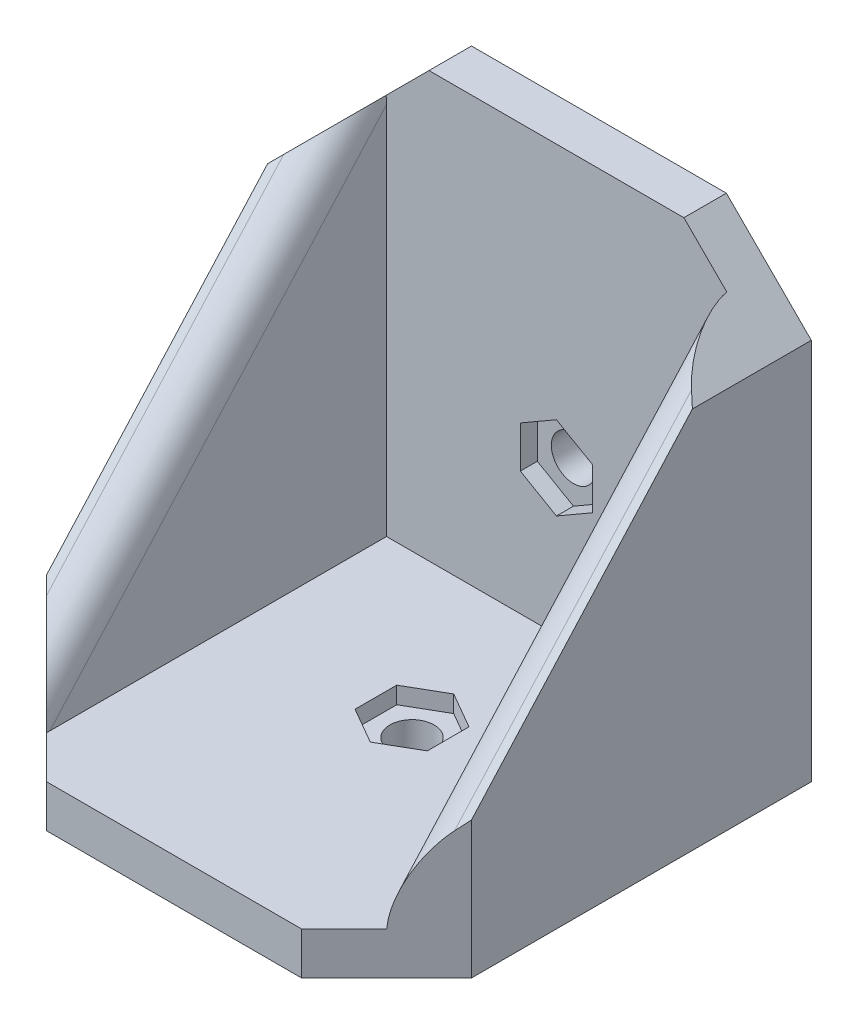
ISO-10303-21;
HEADER;
FILE_DESCRIPTION(('STEP AP214'),'2;1');
FILE_NAME('part.step','',(''),(''),'','','');
FILE_SCHEMA(('AUTOMOTIVE_DESIGN { 1 0 10303 214 1 1 1 1 }'));
ENDSEC;
DATA;
#1=APPLICATION_CONTEXT('core data for automotive mechanical design processes');
#2=APPLICATION_PROTOCOL_DEFINITION('international standard','automotive_design',2000,#1);
#3=PRODUCT_CONTEXT('',#1,'mechanical');
#4=PRODUCT('Part','Part','',(#3));
#5=PRODUCT_RELATED_PRODUCT_CATEGORY('part','',(#4));
#6=PRODUCT_DEFINITION_FORMATION('','',#4);
#7=PRODUCT_DEFINITION_CONTEXT('part definition',#1,'design');
#8=PRODUCT_DEFINITION('design','',#6,#7);
#9=PRODUCT_DEFINITION_SHAPE('','',#8);
#10=(LENGTH_UNIT() NAMED_UNIT(*) SI_UNIT(.MILLI.,.METRE.));
#11=(NAMED_UNIT(*) PLANE_ANGLE_UNIT() SI_UNIT($,.RADIAN.));
#12=(NAMED_UNIT(*) SI_UNIT($,.STERADIAN.) SOLID_ANGLE_UNIT());
#13=UNCERTAINTY_MEASURE_WITH_UNIT(LENGTH_MEASURE(1.E-05),#10,'distance_accuracy_value','');
#14=(GEOMETRIC_REPRESENTATION_CONTEXT(3) GLOBAL_UNCERTAINTY_ASSIGNED_CONTEXT((#13)) GLOBAL_UNIT_ASSIGNED_CONTEXT((#10,
#11,#12)) REPRESENTATION_CONTEXT('',''));
#15=CARTESIAN_POINT('',(0.,0.,0.));
#16=DIRECTION('',(0.,0.,1.));
#17=DIRECTION('',(1.,0.,0.));
#18=AXIS2_PLACEMENT_3D('',#15,#16,#17);
#19=CARTESIAN_POINT('',(0.,5.,0.));
#20=DIRECTION('',(0.,1.,0.));
#21=DIRECTION('',(0.,0.,1.));
#22=AXIS2_PLACEMENT_3D('',#19,#20,#21);
#23=PLANE('',#22);
#24=DIRECTION('',(-0.866025403784439,0.,-0.5));
#25=VECTOR('',#24,1.);
#26=CARTESIAN_POINT('',(4.25,5.,-5.45373864405591));
#27=LINE('',#26,#25);
#28=CARTESIAN_POINT('',(4.25,5.,-5.45373864405591));
#29=VERTEX_POINT('',#28);
#30=CARTESIAN_POINT('',(0.,5.,-7.90747728811182));
#31=VERTEX_POINT('',#30);
#32=EDGE_CURVE('E274',#29,#31,#27,.T.);
#33=ORIENTED_EDGE('',*,*,#32,.F.);
#34=DIRECTION('',(0.,0.,-1.));
#35=VECTOR('',#34,1.);
#36=CARTESIAN_POINT('',(4.25,5.,-0.54626135594409));
#37=LINE('',#36,#35);
#38=CARTESIAN_POINT('',(4.25,5.,-0.54626135594409));
#39=VERTEX_POINT('',#38);
#40=EDGE_CURVE('E313',#39,#29,#37,.T.);
#41=ORIENTED_EDGE('',*,*,#40,.F.);
#42=DIRECTION('',(0.866025403784439,0.,-0.5));
#43=VECTOR('',#42,1.);
#44=CARTESIAN_POINT('',(0.,5.,1.90747728811182));
#45=LINE('',#44,#43);
#46=CARTESIAN_POINT('',(0.,5.,1.90747728811182));
#47=VERTEX_POINT('',#46);
#48=EDGE_CURVE('E309',#47,#39,#45,.T.);
#49=ORIENTED_EDGE('',*,*,#48,.F.);
#50=DIRECTION('',(0.866025403784439,0.,0.5));
#51=VECTOR('',#50,1.);
#52=CARTESIAN_POINT('',(-4.25,5.,-0.546261355944092));
#53=LINE('',#52,#51);
#54=CARTESIAN_POINT('',(-4.25,5.,-0.546261355944092));
#55=VERTEX_POINT('',#54);
#56=EDGE_CURVE('E305',#55,#47,#53,.T.);
#57=ORIENTED_EDGE('',*,*,#56,.F.);
#58=DIRECTION('',(0.,0.,1.));
#59=VECTOR('',#58,1.);
#60=CARTESIAN_POINT('',(-4.25,5.,-5.45373864405591));
#61=LINE('',#60,#59);
#62=CARTESIAN_POINT('',(-4.25,5.,-5.45373864405591));
#63=VERTEX_POINT('',#62);
#64=EDGE_CURVE('E301',#63,#55,#61,.T.);
#65=ORIENTED_EDGE('',*,*,#64,.F.);
#66=DIRECTION('',(-0.866025403784439,0.,0.5));
#67=VECTOR('',#66,1.);
#68=CARTESIAN_POINT('',(0.,5.,-7.90747728811182));
#69=LINE('',#68,#67);
#70=EDGE_CURVE('E297',#31,#63,#69,.T.);
#71=ORIENTED_EDGE('',*,*,#70,.F.);
#72=EDGE_LOOP('',(#33,#41,#49,#57,#65,#71));
#73=FACE_BOUND('',#72,.T.);
#74=DIRECTION('',(-0.707106781186549,0.,0.707106781186547));
#75=VECTOR('',#74,1.);
#76=CARTESIAN_POINT('',(20.,5.,20.));
#77=LINE('',#76,#75);
#78=CARTESIAN_POINT('',(15.,5.,25.));
#79=VERTEX_POINT('',#78);
#80=CARTESIAN_POINT('',(20.0095625354264,5.,19.9904374645736));
#81=VERTEX_POINT('',#80);
#82=EDGE_CURVE('E483',#79,#81,#77,.F.);
#83=ORIENTED_EDGE('',*,*,#82,.T.);
#84=CARTESIAN_POINT('',(24.,5.,19.6185503811705));
#85=DIRECTION('',(0.,1.,0.));
#86=DIRECTION('',(0.,0.,-1.));
#87=AXIS2_PLACEMENT_3D('',#84,#85,#86);
#88=ELLIPSE('',#87,5.38144961882948,4.);
#89=CARTESIAN_POINT('',(20.,5.,19.6185503811705));
#90=VERTEX_POINT('',#89);
#91=EDGE_CURVE('E528',#81,#90,#88,.F.);
#92=ORIENTED_EDGE('',*,*,#91,.T.);
#93=DIRECTION('',(0.,0.,1.));
#94=VECTOR('',#93,1.);
#95=CARTESIAN_POINT('',(20.,5.,-25.));
#96=LINE('',#95,#94);
#97=CARTESIAN_POINT('',(20.,5.,-20.));
#98=VERTEX_POINT('',#97);
#99=EDGE_CURVE('E261',#98,#90,#96,.T.);
#100=ORIENTED_EDGE('',*,*,#99,.F.);
#101=DIRECTION('',(1.,0.,0.));
#102=VECTOR('',#101,1.);
#103=CARTESIAN_POINT('',(-25.,5.,-20.));
#104=LINE('',#103,#102);
#105=CARTESIAN_POINT('',(-20.,5.,-20.));
#106=VERTEX_POINT('',#105);
#107=EDGE_CURVE('E403',#106,#98,#104,.T.);
#108=ORIENTED_EDGE('',*,*,#107,.F.);
#109=DIRECTION('',(0.,0.,1.));
#110=VECTOR('',#109,1.);
#111=CARTESIAN_POINT('',(-20.,5.,-25.));
#112=LINE('',#111,#110);
#113=CARTESIAN_POINT('',(-20.,5.,19.6185503811705));
#114=VERTEX_POINT('',#113);
#115=EDGE_CURVE('E269',#106,#114,#112,.T.);
#116=ORIENTED_EDGE('',*,*,#115,.T.);
#117=CARTESIAN_POINT('',(-24.,5.,19.6185503811705));
#118=DIRECTION('',(0.,1.,0.));
#119=DIRECTION('',(0.,0.,-1.));
#120=AXIS2_PLACEMENT_3D('',#117,#118,#119);
#121=ELLIPSE('',#120,5.38144961882948,4.);
#122=CARTESIAN_POINT('',(-20.0095625354264,5.,19.9904374645736));
#123=VERTEX_POINT('',#122);
#124=EDGE_CURVE('E12',#114,#123,#121,.F.);
#125=ORIENTED_EDGE('',*,*,#124,.T.);
#126=DIRECTION('',(-0.707106781186546,0.,-0.707106781186549));
#127=VECTOR('',#126,1.);
#128=CARTESIAN_POINT('',(-20.,5.,20.));
#129=LINE('',#128,#127);
#130=CARTESIAN_POINT('',(-15.,5.,25.));
#131=VERTEX_POINT('',#130);
#132=EDGE_CURVE('E59',#123,#131,#129,.F.);
#133=ORIENTED_EDGE('',*,*,#132,.T.);
#134=DIRECTION('',(1.,0.,0.));
#135=VECTOR('',#134,1.);
#136=CARTESIAN_POINT('',(-25.,5.,25.));
#137=LINE('',#136,#135);
#138=EDGE_CURVE('E417',#131,#79,#137,.T.);
#139=ORIENTED_EDGE('',*,*,#138,.T.);
#140=EDGE_LOOP('',(#83,#92,#100,#108,#116,#125,#133,#139));
#141=FACE_BOUND('',#140,.T.);
#142=ADVANCED_FACE('F43',(#73,#141),#23,.T.);
#143=CARTESIAN_POINT('',(-25.,55.,-20.));
#144=DIRECTION('',(0.,0.,-1.));
#145=DIRECTION('',(-1.,0.,0.));
#146=AXIS2_PLACEMENT_3D('',#143,#144,#145);
#147=PLANE('',#146);
#148=DIRECTION('',(-0.866025403784438,-0.500000000000001,0.));
#149=VECTOR('',#148,1.);
#150=CARTESIAN_POINT('',(0.,26.9074772881118,-20.));
#151=LINE('',#150,#149);
#152=CARTESIAN_POINT('',(0.,26.9074772881118,-20.));
#153=VERTEX_POINT('',#152);
#154=CARTESIAN_POINT('',(-4.24999999999999,24.4537386440559,-20.));
#155=VERTEX_POINT('',#154);
#156=EDGE_CURVE('E358',#153,#155,#151,.T.);
#157=ORIENTED_EDGE('',*,*,#156,.F.);
#158=DIRECTION('',(-0.866025403784439,0.5,0.));
#159=VECTOR('',#158,1.);
#160=CARTESIAN_POINT('',(4.25,24.4537386440559,-20.));
#161=LINE('',#160,#159);
#162=CARTESIAN_POINT('',(4.25,24.4537386440559,-20.));
#163=VERTEX_POINT('',#162);
#164=EDGE_CURVE('E355',#163,#153,#161,.T.);
#165=ORIENTED_EDGE('',*,*,#164,.F.);
#166=DIRECTION('',(0.,1.,0.));
#167=VECTOR('',#166,1.);
#168=CARTESIAN_POINT('',(4.25,19.5462613559441,-20.));
#169=LINE('',#168,#167);
#170=CARTESIAN_POINT('',(4.25,19.5462613559441,-20.));
#171=VERTEX_POINT('',#170);
#172=EDGE_CURVE('E374',#171,#163,#169,.T.);
#173=ORIENTED_EDGE('',*,*,#172,.F.);
#174=DIRECTION('',(0.866025403784439,0.5,0.));
#175=VECTOR('',#174,1.);
#176=CARTESIAN_POINT('',(0.,17.0925227118882,-20.));
#177=LINE('',#176,#175);
#178=CARTESIAN_POINT('',(0.,17.0925227118882,-20.));
#179=VERTEX_POINT('',#178);
#180=EDGE_CURVE('E370',#179,#171,#177,.T.);
#181=ORIENTED_EDGE('',*,*,#180,.F.);
#182=DIRECTION('',(0.866025403784439,-0.5,0.));
#183=VECTOR('',#182,1.);
#184=CARTESIAN_POINT('',(-4.25,19.5462613559441,-20.));
#185=LINE('',#184,#183);
#186=CARTESIAN_POINT('',(-4.25,19.5462613559441,-20.));
#187=VERTEX_POINT('',#186);
#188=EDGE_CURVE('E366',#187,#179,#185,.T.);
#189=ORIENTED_EDGE('',*,*,#188,.F.);
#190=DIRECTION('',(0.,-1.,0.));
#191=VECTOR('',#190,1.);
#192=CARTESIAN_POINT('',(-4.24999999999999,24.4537386440559,-20.));
#193=LINE('',#192,#191);
#194=EDGE_CURVE('E362',#155,#187,#193,.T.);
#195=ORIENTED_EDGE('',*,*,#194,.F.);
#196=EDGE_LOOP('',(#157,#165,#173,#181,#189,#195));
#197=FACE_BOUND('',#196,.T.);
#198=DIRECTION('',(0.,-1.,0.));
#199=VECTOR('',#198,1.);
#200=CARTESIAN_POINT('',(20.,5.,-20.));
#201=LINE('',#200,#199);
#202=CARTESIAN_POINT('',(20.,49.0206115346339,-20.));
#203=VERTEX_POINT('',#202);
#204=EDGE_CURVE('E256',#203,#98,#201,.T.);
#205=ORIENTED_EDGE('',*,*,#204,.F.);
#206=CARTESIAN_POINT('',(24.,49.0206115346339,-20.));
#207=DIRECTION('',(0.,0.,-1.));
#208=DIRECTION('',(0.,1.,0.));
#209=AXIS2_PLACEMENT_3D('',#206,#207,#208);
#210=ELLIPSE('',#209,5.97938846536609,4.);
#211=CARTESIAN_POINT('',(20.0487457511199,49.9512542488801,-20.));
#212=VERTEX_POINT('',#211);
#213=EDGE_CURVE('E524',#203,#212,#210,.T.);
#214=ORIENTED_EDGE('',*,*,#213,.T.);
#215=DIRECTION('',(0.707106781186546,-0.707106781186548,0.));
#216=VECTOR('',#215,1.);
#217=CARTESIAN_POINT('',(15.,55.,-20.));
#218=LINE('',#217,#216);
#219=CARTESIAN_POINT('',(15.,55.,-20.));
#220=VERTEX_POINT('',#219);
#221=EDGE_CURVE('E451',#212,#220,#218,.F.);
#222=ORIENTED_EDGE('',*,*,#221,.T.);
#223=DIRECTION('',(1.,0.,0.));
#224=VECTOR('',#223,1.);
#225=CARTESIAN_POINT('',(-25.,55.,-20.));
#226=LINE('',#225,#224);
#227=CARTESIAN_POINT('',(-15.,55.,-20.));
#228=VERTEX_POINT('',#227);
#229=EDGE_CURVE('E409',#228,#220,#226,.T.);
#230=ORIENTED_EDGE('',*,*,#229,.F.);
#231=DIRECTION('',(0.707106781186547,0.707106781186549,0.));
#232=VECTOR('',#231,1.);
#233=CARTESIAN_POINT('',(-15.,55.,-20.));
#234=LINE('',#233,#232);
#235=CARTESIAN_POINT('',(-20.0487457511199,49.9512542488801,-20.));
#236=VERTEX_POINT('',#235);
#237=EDGE_CURVE('E454',#228,#236,#234,.F.);
#238=ORIENTED_EDGE('',*,*,#237,.T.);
#239=CARTESIAN_POINT('',(-24.,49.0206115346339,-20.));
#240=DIRECTION('',(0.,0.,-1.));
#241=DIRECTION('',(0.,1.,0.));
#242=AXIS2_PLACEMENT_3D('',#239,#240,#241);
#243=ELLIPSE('',#242,5.97938846536609,4.);
#244=CARTESIAN_POINT('',(-20.,49.0206115346339,-20.));
#245=VERTEX_POINT('',#244);
#246=EDGE_CURVE('E52',#236,#245,#243,.T.);
#247=ORIENTED_EDGE('',*,*,#246,.T.);
#248=DIRECTION('',(0.,-1.,0.));
#249=VECTOR('',#248,1.);
#250=CARTESIAN_POINT('',(-20.,5.,-20.));
#251=LINE('',#250,#249);
#252=EDGE_CURVE('E266',#245,#106,#251,.T.);
#253=ORIENTED_EDGE('',*,*,#252,.T.);
#254=ORIENTED_EDGE('',*,*,#107,.T.);
#255=EDGE_LOOP('',(#205,#214,#222,#230,#238,#247,#253,#254));
#256=FACE_BOUND('',#255,.T.);
#257=ADVANCED_FACE('F544',(#197,#256),#147,.F.);
#258=CARTESIAN_POINT('',(0.,-45.,-3.));
#259=DIRECTION('',(0.,1.,0.));
#260=DIRECTION('',(0.,0.,1.));
#261=AXIS2_PLACEMENT_3D('',#258,#259,#260);
#262=CYLINDRICAL_SURFACE('',#261,2.6);
#263=CARTESIAN_POINT('',(0.,0.,-3.));
#264=DIRECTION('',(0.,1.,0.));
#265=DIRECTION('',(0.,0.,1.));
#266=AXIS2_PLACEMENT_3D('',#263,#264,#265);
#267=CIRCLE('',#266,2.6);
#268=CARTESIAN_POINT('',(0.,0.,-0.400000000000003));
#269=VERTEX_POINT('',#268);
#270=EDGE_CURVE('E404',#269,#269,#267,.T.);
#271=ORIENTED_EDGE('',*,*,#270,.F.);
#272=EDGE_LOOP('',(#271));
#273=FACE_BOUND('',#272,.T.);
#274=CARTESIAN_POINT('',(0.,3.,-3.));
#275=DIRECTION('',(0.,1.,0.));
#276=DIRECTION('',(0.,0.,1.));
#277=AXIS2_PLACEMENT_3D('',#274,#275,#276);
#278=CIRCLE('',#277,2.6);
#279=CARTESIAN_POINT('',(0.,3.,-0.400000000000003));
#280=VERTEX_POINT('',#279);
#281=EDGE_CURVE('E337',#280,#280,#278,.F.);
#282=ORIENTED_EDGE('',*,*,#281,.F.);
#283=EDGE_LOOP('',(#282));
#284=FACE_BOUND('',#283,.T.);
#285=ADVANCED_FACE('F605',(#273,#284),#262,.F.);
#286=CARTESIAN_POINT('',(0.,22.,-70.));
#287=DIRECTION('',(0.,0.,1.));
#288=DIRECTION('',(1.,0.,0.));
#289=AXIS2_PLACEMENT_3D('',#286,#287,#288);
#290=CYLINDRICAL_SURFACE('',#289,2.6);
#291=CARTESIAN_POINT('',(0.,22.,-25.));
#292=DIRECTION('',(0.,0.,1.));
#293=DIRECTION('',(1.,0.,0.));
#294=AXIS2_PLACEMENT_3D('',#291,#292,#293);
#295=CIRCLE('',#294,2.6);
#296=CARTESIAN_POINT('',(2.6,22.,-25.));
#297=VERTEX_POINT('',#296);
#298=EDGE_CURVE('E399',#297,#297,#295,.T.);
#299=ORIENTED_EDGE('',*,*,#298,.F.);
#300=EDGE_LOOP('',(#299));
#301=FACE_BOUND('',#300,.T.);
#302=CARTESIAN_POINT('',(0.,22.,-22.));
#303=DIRECTION('',(0.,0.,1.));
#304=DIRECTION('',(1.,0.,0.));
#305=AXIS2_PLACEMENT_3D('',#302,#303,#304);
#306=CIRCLE('',#305,2.6);
#307=CARTESIAN_POINT('',(2.6,22.,-22.));
#308=VERTEX_POINT('',#307);
#309=EDGE_CURVE('E398',#308,#308,#306,.F.);
#310=ORIENTED_EDGE('',*,*,#309,.F.);
#311=EDGE_LOOP('',(#310));
#312=FACE_BOUND('',#311,.T.);
#313=ADVANCED_FACE('F624',(#301,#312),#290,.F.);
#314=CARTESIAN_POINT('',(25.,5.,-25.));
#315=DIRECTION('',(-1.,0.,0.));
#316=DIRECTION('',(0.,0.,1.));
#317=AXIS2_PLACEMENT_3D('',#314,#315,#316);
#318=PLANE('',#317);
#319=DIRECTION('',(0.,0.,1.));
#320=VECTOR('',#319,1.);
#321=CARTESIAN_POINT('',(25.,45.,-25.));
#322=LINE('',#321,#320);
#323=CARTESIAN_POINT('',(25.,45.,-25.));
#324=VERTEX_POINT('',#323);
#325=CARTESIAN_POINT('',(25.,45.,-11.));
#326=VERTEX_POINT('',#325);
#327=EDGE_CURVE('E228',#324,#326,#322,.T.);
#328=ORIENTED_EDGE('',*,*,#327,.T.);
#329=DIRECTION('',(0.,0.743294146247166,-0.66896473162245));
#330=VECTOR('',#329,1.);
#331=CARTESIAN_POINT('',(25.,29.8618784530387,2.62430939226519));
#332=LINE('',#331,#330);
#333=CARTESIAN_POINT('',(25.,16.1111111111111,15.));
#334=VERTEX_POINT('',#333);
#335=EDGE_CURVE('E233',#334,#326,#332,.T.);
#336=ORIENTED_EDGE('',*,*,#335,.F.);
#337=DIRECTION('',(0.,-1.,0.));
#338=VECTOR('',#337,1.);
#339=CARTESIAN_POINT('',(25.,5.,15.));
#340=LINE('',#339,#338);
#341=CARTESIAN_POINT('',(25.,0.,15.));
#342=VERTEX_POINT('',#341);
#343=EDGE_CURVE('E239',#334,#342,#340,.T.);
#344=ORIENTED_EDGE('',*,*,#343,.T.);
#345=DIRECTION('',(0.,0.,-1.));
#346=VECTOR('',#345,1.);
#347=CARTESIAN_POINT('',(25.,0.,-25.));
#348=LINE('',#347,#346);
#349=CARTESIAN_POINT('',(25.,0.,-25.));
#350=VERTEX_POINT('',#349);
#351=EDGE_CURVE('E413',#342,#350,#348,.T.);
#352=ORIENTED_EDGE('',*,*,#351,.T.);
#353=DIRECTION('',(0.,-1.,0.));
#354=VECTOR('',#353,1.);
#355=CARTESIAN_POINT('',(25.,5.,-25.));
#356=LINE('',#355,#354);
#357=EDGE_CURVE('E235',#324,#350,#356,.T.);
#358=ORIENTED_EDGE('',*,*,#357,.F.);
#359=EDGE_LOOP('',(#328,#336,#344,#352,#358));
#360=FACE_BOUND('',#359,.T.);
#361=ADVANCED_FACE('F230',(#360),#318,.F.);
#362=CARTESIAN_POINT('',(-25.,5.,-25.));
#363=DIRECTION('',(0.,0.,1.));
#364=DIRECTION('',(1.,0.,0.));
#365=AXIS2_PLACEMENT_3D('',#362,#363,#364);
#366=PLANE('',#365);
#367=ORIENTED_EDGE('',*,*,#298,.T.);
#368=EDGE_LOOP('',(#367));
#369=FACE_BOUND('',#368,.T.);
#370=DIRECTION('',(0.,-1.,0.));
#371=VECTOR('',#370,1.);
#372=CARTESIAN_POINT('',(-25.,5.,-25.));
#373=LINE('',#372,#371);
#374=CARTESIAN_POINT('',(-25.,45.,-25.));
#375=VERTEX_POINT('',#374);
#376=CARTESIAN_POINT('',(-25.,0.,-25.));
#377=VERTEX_POINT('',#376);
#378=EDGE_CURVE('E421',#375,#377,#373,.T.);
#379=ORIENTED_EDGE('',*,*,#378,.F.);
#380=DIRECTION('',(-0.707106781186547,-0.707106781186549,0.));
#381=VECTOR('',#380,1.);
#382=CARTESIAN_POINT('',(-15.,55.,-25.));
#383=LINE('',#382,#381);
#384=CARTESIAN_POINT('',(-15.,55.,-25.));
#385=VERTEX_POINT('',#384);
#386=EDGE_CURVE('E464',#375,#385,#383,.F.);
#387=ORIENTED_EDGE('',*,*,#386,.T.);
#388=DIRECTION('',(-1.,0.,0.));
#389=VECTOR('',#388,1.);
#390=CARTESIAN_POINT('',(-25.,55.,-25.));
#391=LINE('',#390,#389);
#392=CARTESIAN_POINT('',(15.,55.,-25.));
#393=VERTEX_POINT('',#392);
#394=EDGE_CURVE('E405',#393,#385,#391,.T.);
#395=ORIENTED_EDGE('',*,*,#394,.F.);
#396=DIRECTION('',(-0.707106781186547,0.707106781186549,0.));
#397=VECTOR('',#396,1.);
#398=CARTESIAN_POINT('',(15.,55.,-25.));
#399=LINE('',#398,#397);
#400=EDGE_CURVE('E461',#393,#324,#399,.F.);
#401=ORIENTED_EDGE('',*,*,#400,.T.);
#402=ORIENTED_EDGE('',*,*,#357,.T.);
#403=DIRECTION('',(-1.,0.,0.));
#404=VECTOR('',#403,1.);
#405=CARTESIAN_POINT('',(-25.,0.,-25.));
#406=LINE('',#405,#404);
#407=EDGE_CURVE('E425',#350,#377,#406,.T.);
#408=ORIENTED_EDGE('',*,*,#407,.T.);
#409=EDGE_LOOP('',(#379,#387,#395,#401,#402,#408));
#410=FACE_BOUND('',#409,.T.);
#411=ADVANCED_FACE('F573',(#369,#410),#366,.F.);
#412=CARTESIAN_POINT('',(-25.,5.,-25.));
#413=DIRECTION('',(1.,0.,0.));
#414=DIRECTION('',(0.,0.,-1.));
#415=AXIS2_PLACEMENT_3D('',#412,#413,#414);
#416=PLANE('',#415);
#417=DIRECTION('',(0.,0.743294146247166,-0.66896473162245));
#418=VECTOR('',#417,1.);
#419=CARTESIAN_POINT('',(-25.,29.8618784530387,2.6243093922652));
#420=LINE('',#419,#418);
#421=CARTESIAN_POINT('',(-25.,16.1111111111111,15.));
#422=VERTEX_POINT('',#421);
#423=CARTESIAN_POINT('',(-25.,45.,-11.));
#424=VERTEX_POINT('',#423);
#425=EDGE_CURVE('E270',#422,#424,#420,.T.);
#426=ORIENTED_EDGE('',*,*,#425,.T.);
#427=DIRECTION('',(0.,0.,-1.));
#428=VECTOR('',#427,1.);
#429=CARTESIAN_POINT('',(-25.,45.,-25.));
#430=LINE('',#429,#428);
#431=EDGE_CURVE('E458',#424,#375,#430,.T.);
#432=ORIENTED_EDGE('',*,*,#431,.T.);
#433=ORIENTED_EDGE('',*,*,#378,.T.);
#434=DIRECTION('',(0.,0.,1.));
#435=VECTOR('',#434,1.);
#436=CARTESIAN_POINT('',(-25.,0.,-25.));
#437=LINE('',#436,#435);
#438=CARTESIAN_POINT('',(-25.,0.,15.));
#439=VERTEX_POINT('',#438);
#440=EDGE_CURVE('E429',#377,#439,#437,.T.);
#441=ORIENTED_EDGE('',*,*,#440,.T.);
#442=DIRECTION('',(0.,1.,0.));
#443=VECTOR('',#442,1.);
#444=CARTESIAN_POINT('',(-25.,5.,15.));
#445=LINE('',#444,#443);
#446=EDGE_CURVE('E457',#439,#422,#445,.T.);
#447=ORIENTED_EDGE('',*,*,#446,.T.);
#448=EDGE_LOOP('',(#426,#432,#433,#441,#447));
#449=FACE_BOUND('',#448,.T.);
#450=ADVANCED_FACE('F568',(#449),#416,.F.);
#451=CARTESIAN_POINT('',(-25.,5.,25.));
#452=DIRECTION('',(0.,0.,-1.));
#453=DIRECTION('',(-1.,0.,0.));
#454=AXIS2_PLACEMENT_3D('',#451,#452,#453);
#455=PLANE('',#454);
#456=DIRECTION('',(1.,0.,0.));
#457=VECTOR('',#456,1.);
#458=CARTESIAN_POINT('',(-25.,0.,25.));
#459=LINE('',#458,#457);
#460=CARTESIAN_POINT('',(-15.,0.,25.));
#461=VERTEX_POINT('',#460);
#462=CARTESIAN_POINT('',(15.,0.,25.));
#463=VERTEX_POINT('',#462);
#464=EDGE_CURVE('E422',#461,#463,#459,.T.);
#465=ORIENTED_EDGE('',*,*,#464,.T.);
#466=DIRECTION('',(0.,1.,0.));
#467=VECTOR('',#466,1.);
#468=CARTESIAN_POINT('',(15.,5.,25.));
#469=LINE('',#468,#467);
#470=EDGE_CURVE('E478',#463,#79,#469,.T.);
#471=ORIENTED_EDGE('',*,*,#470,.T.);
#472=ORIENTED_EDGE('',*,*,#138,.F.);
#473=DIRECTION('',(0.,-1.,0.));
#474=VECTOR('',#473,1.);
#475=CARTESIAN_POINT('',(-15.,5.,25.));
#476=LINE('',#475,#474);
#477=EDGE_CURVE('E474',#131,#461,#476,.T.);
#478=ORIENTED_EDGE('',*,*,#477,.T.);
#479=EDGE_LOOP('',(#465,#471,#472,#478));
#480=FACE_BOUND('',#479,.T.);
#481=ADVANCED_FACE('F557',(#480),#455,.F.);
#482=CARTESIAN_POINT('',(0.,0.,0.));
#483=DIRECTION('',(0.,1.,0.));
#484=DIRECTION('',(0.,0.,1.));
#485=AXIS2_PLACEMENT_3D('',#482,#483,#484);
#486=PLANE('',#485);
#487=ORIENTED_EDGE('',*,*,#270,.T.);
#488=EDGE_LOOP('',(#487));
#489=FACE_BOUND('',#488,.T.);
#490=ORIENTED_EDGE('',*,*,#351,.F.);
#491=DIRECTION('',(0.707106781186549,0.,-0.707106781186547));
#492=VECTOR('',#491,1.);
#493=CARTESIAN_POINT('',(25.,0.,15.));
#494=LINE('',#493,#492);
#495=EDGE_CURVE('E471',#342,#463,#494,.F.);
#496=ORIENTED_EDGE('',*,*,#495,.T.);
#497=ORIENTED_EDGE('',*,*,#464,.F.);
#498=DIRECTION('',(0.707106781186546,0.,0.707106781186549));
#499=VECTOR('',#498,1.);
#500=CARTESIAN_POINT('',(-15.,0.,25.));
#501=LINE('',#500,#499);
#502=EDGE_CURVE('E238',#461,#439,#501,.F.);
#503=ORIENTED_EDGE('',*,*,#502,.T.);
#504=ORIENTED_EDGE('',*,*,#440,.F.);
#505=ORIENTED_EDGE('',*,*,#407,.F.);
#506=EDGE_LOOP('',(#490,#496,#497,#503,#504,#505));
#507=FACE_BOUND('',#506,.T.);
#508=ADVANCED_FACE('F565',(#489,#507),#486,.F.);
#509=CARTESIAN_POINT('',(0.,55.,0.));
#510=DIRECTION('',(0.,-1.,0.));
#511=DIRECTION('',(0.,0.,-1.));
#512=AXIS2_PLACEMENT_3D('',#509,#510,#511);
#513=PLANE('',#512);
#514=ORIENTED_EDGE('',*,*,#394,.T.);
#515=DIRECTION('',(0.,0.,1.));
#516=VECTOR('',#515,1.);
#517=CARTESIAN_POINT('',(-15.,55.,0.));
#518=LINE('',#517,#516);
#519=EDGE_CURVE('E447',#385,#228,#518,.T.);
#520=ORIENTED_EDGE('',*,*,#519,.T.);
#521=ORIENTED_EDGE('',*,*,#229,.T.);
#522=DIRECTION('',(0.,0.,-1.));
#523=VECTOR('',#522,1.);
#524=CARTESIAN_POINT('',(15.,55.,0.));
#525=LINE('',#524,#523);
#526=EDGE_CURVE('E440',#220,#393,#525,.T.);
#527=ORIENTED_EDGE('',*,*,#526,.T.);
#528=EDGE_LOOP('',(#514,#520,#521,#527));
#529=FACE_BOUND('',#528,.T.);
#530=ADVANCED_FACE('F613',(#529),#513,.F.);
#531=CARTESIAN_POINT('',(-15.,55.,0.));
#532=DIRECTION('',(0.707106781186549,-0.707106781186547,0.));
#533=DIRECTION('',(0.,0.,1.));
#534=AXIS2_PLACEMENT_3D('',#531,#532,#533);
#535=PLANE('',#534);
#536=CARTESIAN_POINT('',(-24.,46.,-17.2814496188295));
#537=DIRECTION('',(0.707106781186549,-0.707106781186547,0.));
#538=DIRECTION('',(0.436852028330519,0.43685202833052,-0.786333650994934));
#539=AXIS2_PLACEMENT_3D('',#536,#537,#538);
#540=ELLIPSE('',#539,7.61051903617619,4.);
#541=CARTESIAN_POINT('',(-24.,46.,-11.9));
#542=VERTEX_POINT('',#541);
#543=EDGE_CURVE('E514',#542,#236,#540,.F.);
#544=ORIENTED_EDGE('',*,*,#543,.T.);
#545=ORIENTED_EDGE('',*,*,#237,.F.);
#546=ORIENTED_EDGE('',*,*,#519,.F.);
#547=ORIENTED_EDGE('',*,*,#386,.F.);
#548=ORIENTED_EDGE('',*,*,#431,.F.);
#549=DIRECTION('',(0.596549986271892,0.596549986271894,-0.536894987644705));
#550=VECTOR('',#549,1.);
#551=CARTESIAN_POINT('',(-32.9715302491103,37.0284697508896,-3.82562277580067));
#552=LINE('',#551,#550);
#553=EDGE_CURVE('E249',#424,#542,#552,.T.);
#554=ORIENTED_EDGE('',*,*,#553,.T.);
#555=EDGE_LOOP('',(#544,#545,#546,#547,#548,#554));
#556=FACE_BOUND('',#555,.T.);
#557=ADVANCED_FACE('F583',(#556),#535,.F.);
#558=CARTESIAN_POINT('',(15.,55.,0.));
#559=DIRECTION('',(-0.707106781186548,-0.707106781186546,0.));
#560=DIRECTION('',(0.,0.,-1.));
#561=AXIS2_PLACEMENT_3D('',#558,#559,#560);
#562=PLANE('',#561);
#563=ORIENTED_EDGE('',*,*,#221,.F.);
#564=CARTESIAN_POINT('',(24.,46.,-17.2814496188295));
#565=DIRECTION('',(-0.707106781186548,-0.707106781186546,0.));
#566=DIRECTION('',(-0.436852028330519,0.43685202833052,-0.786333650994934));
#567=AXIS2_PLACEMENT_3D('',#564,#565,#566);
#568=ELLIPSE('',#567,7.61051903617619,4.);
#569=CARTESIAN_POINT('',(24.,46.,-11.9));
#570=VERTEX_POINT('',#569);
#571=EDGE_CURVE('E245',#212,#570,#568,.F.);
#572=ORIENTED_EDGE('',*,*,#571,.T.);
#573=DIRECTION('',(-0.596549986271893,0.596549986271894,-0.536894987644705));
#574=VECTOR('',#573,1.);
#575=CARTESIAN_POINT('',(32.9715302491103,37.0284697508897,-3.8256227758007));
#576=LINE('',#575,#574);
#577=EDGE_CURVE('E242',#326,#570,#576,.T.);
#578=ORIENTED_EDGE('',*,*,#577,.F.);
#579=ORIENTED_EDGE('',*,*,#327,.F.);
#580=ORIENTED_EDGE('',*,*,#400,.F.);
#581=ORIENTED_EDGE('',*,*,#526,.F.);
#582=EDGE_LOOP('',(#563,#572,#578,#579,#580,#581));
#583=FACE_BOUND('',#582,.T.);
#584=ADVANCED_FACE('F243',(#583),#562,.F.);
#585=CARTESIAN_POINT('',(25.,5.,15.));
#586=DIRECTION('',(-0.707106781186547,0.,-0.707106781186549));
#587=DIRECTION('',(0.,-1.,0.));
#588=AXIS2_PLACEMENT_3D('',#585,#586,#587);
#589=PLANE('',#588);
#590=CARTESIAN_POINT('',(24.,9.02061153463392,16.));
#591=DIRECTION('',(-0.707106781186547,0.,-0.707106781186549));
#592=DIRECTION('',(0.379642086548638,0.843649081219196,-0.379642086548637));
#593=AXIS2_PLACEMENT_3D('',#590,#591,#592);
#594=ELLIPSE('',#593,8.45613226241796,4.);
#595=CARTESIAN_POINT('',(24.,15.,16.));
#596=VERTEX_POINT('',#595);
#597=EDGE_CURVE('E506',#596,#81,#594,.F.);
#598=ORIENTED_EDGE('',*,*,#597,.T.);
#599=ORIENTED_EDGE('',*,*,#82,.F.);
#600=ORIENTED_EDGE('',*,*,#470,.F.);
#601=ORIENTED_EDGE('',*,*,#495,.F.);
#602=ORIENTED_EDGE('',*,*,#343,.F.);
#603=DIRECTION('',(0.556021856893695,0.617802063215215,-0.556021856893694));
#604=VECTOR('',#603,1.);
#605=CARTESIAN_POINT('',(32.0038167938931,23.8931297709923,7.99618320610689));
#606=LINE('',#605,#604);
#607=EDGE_CURVE('E253',#596,#334,#606,.T.);
#608=ORIENTED_EDGE('',*,*,#607,.F.);
#609=EDGE_LOOP('',(#598,#599,#600,#601,#602,#608));
#610=FACE_BOUND('',#609,.T.);
#611=ADVANCED_FACE('F575',(#610),#589,.F.);
#612=CARTESIAN_POINT('',(-15.,5.,25.));
#613=DIRECTION('',(0.707106781186549,0.,-0.707106781186546));
#614=DIRECTION('',(0.,-1.,0.));
#615=AXIS2_PLACEMENT_3D('',#612,#613,#614);
#616=PLANE('',#615);
#617=ORIENTED_EDGE('',*,*,#132,.F.);
#618=CARTESIAN_POINT('',(-24.,9.02061153463394,16.));
#619=DIRECTION('',(0.707106781186549,0.,-0.707106781186546));
#620=DIRECTION('',(-0.379642086548638,0.843649081219195,-0.379642086548639));
#621=AXIS2_PLACEMENT_3D('',#618,#619,#620);
#622=ELLIPSE('',#621,8.45613226241799,4.);
#623=CARTESIAN_POINT('',(-24.,15.,16.));
#624=VERTEX_POINT('',#623);
#625=EDGE_CURVE('E521',#123,#624,#622,.F.);
#626=ORIENTED_EDGE('',*,*,#625,.T.);
#627=DIRECTION('',(-0.556021856893693,0.617802063215216,-0.556021856893694));
#628=VECTOR('',#627,1.);
#629=CARTESIAN_POINT('',(-32.0038167938931,23.8931297709924,7.99618320610685));
#630=LINE('',#629,#628);
#631=EDGE_CURVE('E257',#624,#422,#630,.T.);
#632=ORIENTED_EDGE('',*,*,#631,.T.);
#633=ORIENTED_EDGE('',*,*,#446,.F.);
#634=ORIENTED_EDGE('',*,*,#502,.F.);
#635=ORIENTED_EDGE('',*,*,#477,.F.);
#636=EDGE_LOOP('',(#617,#626,#632,#633,#634,#635));
#637=FACE_BOUND('',#636,.T.);
#638=ADVANCED_FACE('F560',(#637),#616,.F.);
#639=CARTESIAN_POINT('',(-25.,5.,-22.));
#640=DIRECTION('',(0.,0.,1.));
#641=DIRECTION('',(1.,0.,0.));
#642=AXIS2_PLACEMENT_3D('',#639,#640,#641);
#643=PLANE('',#642);
#644=DIRECTION('',(0.866025403784439,-0.5,0.));
#645=VECTOR('',#644,1.);
#646=CARTESIAN_POINT('',(4.25,24.4537386440559,-22.));
#647=LINE('',#646,#645);
#648=CARTESIAN_POINT('',(0.,26.9074772881118,-22.));
#649=VERTEX_POINT('',#648);
#650=CARTESIAN_POINT('',(4.25,24.4537386440559,-22.));
#651=VERTEX_POINT('',#650);
#652=EDGE_CURVE('E351',#649,#651,#647,.T.);
#653=ORIENTED_EDGE('',*,*,#652,.F.);
#654=DIRECTION('',(0.866025403784438,0.500000000000001,0.));
#655=VECTOR('',#654,1.);
#656=CARTESIAN_POINT('',(0.,26.9074772881118,-22.));
#657=LINE('',#656,#655);
#658=CARTESIAN_POINT('',(-4.24999999999999,24.4537386440559,-22.));
#659=VERTEX_POINT('',#658);
#660=EDGE_CURVE('E354',#659,#649,#657,.T.);
#661=ORIENTED_EDGE('',*,*,#660,.F.);
#662=DIRECTION('',(0.,1.,0.));
#663=VECTOR('',#662,1.);
#664=CARTESIAN_POINT('',(-4.24999999999999,24.4537386440559,-22.));
#665=LINE('',#664,#663);
#666=CARTESIAN_POINT('',(-4.25,19.5462613559441,-22.));
#667=VERTEX_POINT('',#666);
#668=EDGE_CURVE('E338',#667,#659,#665,.T.);
#669=ORIENTED_EDGE('',*,*,#668,.F.);
#670=DIRECTION('',(-0.866025403784439,0.5,0.));
#671=VECTOR('',#670,1.);
#672=CARTESIAN_POINT('',(-4.25,19.5462613559441,-22.));
#673=LINE('',#672,#671);
#674=CARTESIAN_POINT('',(0.,17.0925227118882,-22.));
#675=VERTEX_POINT('',#674);
#676=EDGE_CURVE('E341',#675,#667,#673,.T.);
#677=ORIENTED_EDGE('',*,*,#676,.F.);
#678=DIRECTION('',(-0.866025403784439,-0.5,0.));
#679=VECTOR('',#678,1.);
#680=CARTESIAN_POINT('',(0.,17.0925227118882,-22.));
#681=LINE('',#680,#679);
#682=CARTESIAN_POINT('',(4.25,19.5462613559441,-22.));
#683=VERTEX_POINT('',#682);
#684=EDGE_CURVE('E345',#683,#675,#681,.T.);
#685=ORIENTED_EDGE('',*,*,#684,.F.);
#686=DIRECTION('',(0.,-1.,0.));
#687=VECTOR('',#686,1.);
#688=CARTESIAN_POINT('',(4.25,19.5462613559441,-22.));
#689=LINE('',#688,#687);
#690=EDGE_CURVE('E348',#651,#683,#689,.T.);
#691=ORIENTED_EDGE('',*,*,#690,.F.);
#692=EDGE_LOOP('',(#653,#661,#669,#677,#685,#691));
#693=FACE_BOUND('',#692,.T.);
#694=ORIENTED_EDGE('',*,*,#309,.T.);
#695=EDGE_LOOP('',(#694));
#696=FACE_BOUND('',#695,.T.);
#697=ADVANCED_FACE('F644',(#693,#696),#643,.T.);
#698=CARTESIAN_POINT('',(4.25,24.4537386440559,-37.9839644690416));
#699=DIRECTION('',(0.5,0.866025403784438,0.));
#700=DIRECTION('',(-0.866025403784439,0.5,0.));
#701=AXIS2_PLACEMENT_3D('',#698,#699,#700);
#702=PLANE('',#701);
#703=ORIENTED_EDGE('',*,*,#652,.T.);
#704=DIRECTION('',(0.,0.,1.));
#705=VECTOR('',#704,1.);
#706=CARTESIAN_POINT('',(4.25,24.4537386440559,-37.9839644690416));
#707=LINE('',#706,#705);
#708=EDGE_CURVE('E342',#651,#163,#707,.T.);
#709=ORIENTED_EDGE('',*,*,#708,.T.);
#710=ORIENTED_EDGE('',*,*,#164,.T.);
#711=DIRECTION('',(0.,0.,1.));
#712=VECTOR('',#711,1.);
#713=CARTESIAN_POINT('',(0.,26.9074772881118,-37.9839644690416));
#714=LINE('',#713,#712);
#715=EDGE_CURVE('E378',#649,#153,#714,.T.);
#716=ORIENTED_EDGE('',*,*,#715,.F.);
#717=EDGE_LOOP('',(#703,#709,#710,#716));
#718=FACE_BOUND('',#717,.T.);
#719=ADVANCED_FACE('F845',(#718),#702,.F.);
#720=CARTESIAN_POINT('',(4.25,19.5462613559441,-37.9839644690416));
#721=DIRECTION('',(1.,0.,0.));
#722=DIRECTION('',(0.,0.,-1.));
#723=AXIS2_PLACEMENT_3D('',#720,#721,#722);
#724=PLANE('',#723);
#725=ORIENTED_EDGE('',*,*,#690,.T.);
#726=DIRECTION('',(0.,0.,1.));
#727=VECTOR('',#726,1.);
#728=CARTESIAN_POINT('',(4.25,19.5462613559441,-37.9839644690416));
#729=LINE('',#728,#727);
#730=EDGE_CURVE('E381',#683,#171,#729,.T.);
#731=ORIENTED_EDGE('',*,*,#730,.T.);
#732=ORIENTED_EDGE('',*,*,#172,.T.);
#733=ORIENTED_EDGE('',*,*,#708,.F.);
#734=EDGE_LOOP('',(#725,#731,#732,#733));
#735=FACE_BOUND('',#734,.T.);
#736=ADVANCED_FACE('F835',(#735),#724,.F.);
#737=CARTESIAN_POINT('',(0.,17.0925227118882,-37.9839644690416));
#738=DIRECTION('',(0.5,-0.866025403784439,0.));
#739=DIRECTION('',(0.866025403784439,0.5,0.));
#740=AXIS2_PLACEMENT_3D('',#737,#738,#739);
#741=PLANE('',#740);
#742=ORIENTED_EDGE('',*,*,#684,.T.);
#743=DIRECTION('',(0.,0.,1.));
#744=VECTOR('',#743,1.);
#745=CARTESIAN_POINT('',(0.,17.0925227118882,-37.9839644690416));
#746=LINE('',#745,#744);
#747=EDGE_CURVE('E384',#675,#179,#746,.T.);
#748=ORIENTED_EDGE('',*,*,#747,.T.);
#749=ORIENTED_EDGE('',*,*,#180,.T.);
#750=ORIENTED_EDGE('',*,*,#730,.F.);
#751=EDGE_LOOP('',(#742,#748,#749,#750));
#752=FACE_BOUND('',#751,.T.);
#753=ADVANCED_FACE('F825',(#752),#741,.F.);
#754=CARTESIAN_POINT('',(-4.25,19.5462613559441,-37.9839644690416));
#755=DIRECTION('',(-0.5,-0.866025403784438,0.));
#756=DIRECTION('',(0.866025403784439,-0.5,0.));
#757=AXIS2_PLACEMENT_3D('',#754,#755,#756);
#758=PLANE('',#757);
#759=ORIENTED_EDGE('',*,*,#676,.T.);
#760=DIRECTION('',(0.,0.,1.));
#761=VECTOR('',#760,1.);
#762=CARTESIAN_POINT('',(-4.25,19.5462613559441,-37.9839644690416));
#763=LINE('',#762,#761);
#764=EDGE_CURVE('E387',#667,#187,#763,.T.);
#765=ORIENTED_EDGE('',*,*,#764,.T.);
#766=ORIENTED_EDGE('',*,*,#188,.T.);
#767=ORIENTED_EDGE('',*,*,#747,.F.);
#768=EDGE_LOOP('',(#759,#765,#766,#767));
#769=FACE_BOUND('',#768,.T.);
#770=ADVANCED_FACE('F815',(#769),#758,.F.);
#771=CARTESIAN_POINT('',(-4.24999999999999,24.4537386440559,-37.9839644690416));
#772=DIRECTION('',(-1.,0.,0.));
#773=DIRECTION('',(0.,-1.,0.));
#774=AXIS2_PLACEMENT_3D('',#771,#772,#773);
#775=PLANE('',#774);
#776=ORIENTED_EDGE('',*,*,#668,.T.);
#777=DIRECTION('',(0.,0.,1.));
#778=VECTOR('',#777,1.);
#779=CARTESIAN_POINT('',(-4.24999999999999,24.4537386440559,-37.9839644690416));
#780=LINE('',#779,#778);
#781=EDGE_CURVE('E390',#659,#155,#780,.T.);
#782=ORIENTED_EDGE('',*,*,#781,.T.);
#783=ORIENTED_EDGE('',*,*,#194,.T.);
#784=ORIENTED_EDGE('',*,*,#764,.F.);
#785=EDGE_LOOP('',(#776,#782,#783,#784));
#786=FACE_BOUND('',#785,.T.);
#787=ADVANCED_FACE('F805',(#786),#775,.F.);
#788=CARTESIAN_POINT('',(0.,26.9074772881118,-37.9839644690416));
#789=DIRECTION('',(-0.500000000000001,0.866025403784438,0.));
#790=DIRECTION('',(-0.866025403784438,-0.500000000000001,0.));
#791=AXIS2_PLACEMENT_3D('',#788,#789,#790);
#792=PLANE('',#791);
#793=ORIENTED_EDGE('',*,*,#660,.T.);
#794=ORIENTED_EDGE('',*,*,#715,.T.);
#795=ORIENTED_EDGE('',*,*,#156,.T.);
#796=ORIENTED_EDGE('',*,*,#781,.F.);
#797=EDGE_LOOP('',(#793,#794,#795,#796));
#798=FACE_BOUND('',#797,.T.);
#799=ADVANCED_FACE('F788',(#798),#792,.F.);
#800=CARTESIAN_POINT('',(0.,3.,0.));
#801=DIRECTION('',(0.,1.,0.));
#802=DIRECTION('',(0.,0.,1.));
#803=AXIS2_PLACEMENT_3D('',#800,#801,#802);
#804=PLANE('',#803);
#805=DIRECTION('',(0.866025403784439,0.,0.5));
#806=VECTOR('',#805,1.);
#807=CARTESIAN_POINT('',(4.25,3.,-5.45373864405591));
#808=LINE('',#807,#806);
#809=CARTESIAN_POINT('',(0.,3.,-7.90747728811182));
#810=VERTEX_POINT('',#809);
#811=CARTESIAN_POINT('',(4.25,3.,-5.45373864405591));
#812=VERTEX_POINT('',#811);
#813=EDGE_CURVE('E291',#810,#812,#808,.T.);
#814=ORIENTED_EDGE('',*,*,#813,.F.);
#815=DIRECTION('',(0.866025403784439,0.,-0.5));
#816=VECTOR('',#815,1.);
#817=CARTESIAN_POINT('',(0.,3.,-7.90747728811182));
#818=LINE('',#817,#816);
#819=CARTESIAN_POINT('',(-4.25,3.,-5.45373864405591));
#820=VERTEX_POINT('',#819);
#821=EDGE_CURVE('E294',#820,#810,#818,.T.);
#822=ORIENTED_EDGE('',*,*,#821,.F.);
#823=DIRECTION('',(0.,0.,-1.));
#824=VECTOR('',#823,1.);
#825=CARTESIAN_POINT('',(-4.25,3.,-5.45373864405591));
#826=LINE('',#825,#824);
#827=CARTESIAN_POINT('',(-4.25,3.,-0.546261355944092));
#828=VERTEX_POINT('',#827);
#829=EDGE_CURVE('E278',#828,#820,#826,.T.);
#830=ORIENTED_EDGE('',*,*,#829,.F.);
#831=DIRECTION('',(-0.866025403784439,0.,-0.5));
#832=VECTOR('',#831,1.);
#833=CARTESIAN_POINT('',(-4.25,3.,-0.546261355944092));
#834=LINE('',#833,#832);
#835=CARTESIAN_POINT('',(0.,3.,1.90747728811182));
#836=VERTEX_POINT('',#835);
#837=EDGE_CURVE('E281',#836,#828,#834,.T.);
#838=ORIENTED_EDGE('',*,*,#837,.F.);
#839=DIRECTION('',(-0.866025403784439,0.,0.5));
#840=VECTOR('',#839,1.);
#841=CARTESIAN_POINT('',(0.,3.,1.90747728811182));
#842=LINE('',#841,#840);
#843=CARTESIAN_POINT('',(4.25,3.,-0.54626135594409));
#844=VERTEX_POINT('',#843);
#845=EDGE_CURVE('E285',#844,#836,#842,.T.);
#846=ORIENTED_EDGE('',*,*,#845,.F.);
#847=DIRECTION('',(0.,0.,1.));
#848=VECTOR('',#847,1.);
#849=CARTESIAN_POINT('',(4.25,3.,-0.54626135594409));
#850=LINE('',#849,#848);
#851=EDGE_CURVE('E288',#812,#844,#850,.T.);
#852=ORIENTED_EDGE('',*,*,#851,.F.);
#853=EDGE_LOOP('',(#814,#822,#830,#838,#846,#852));
#854=FACE_BOUND('',#853,.T.);
#855=ORIENTED_EDGE('',*,*,#281,.T.);
#856=EDGE_LOOP('',(#855));
#857=FACE_BOUND('',#856,.T.);
#858=ADVANCED_FACE('F778',(#854,#857),#804,.T.);
#859=CARTESIAN_POINT('',(4.25,-12.9839644690415,-5.45373864405591));
#860=DIRECTION('',(0.5,0.,-0.866025403784439));
#861=DIRECTION('',(-0.866025403784439,0.,-0.5));
#862=AXIS2_PLACEMENT_3D('',#859,#860,#861);
#863=PLANE('',#862);
#864=ORIENTED_EDGE('',*,*,#813,.T.);
#865=DIRECTION('',(0.,1.,0.));
#866=VECTOR('',#865,1.);
#867=CARTESIAN_POINT('',(4.25,-12.9839644690415,-5.45373864405591));
#868=LINE('',#867,#866);
#869=EDGE_CURVE('E282',#812,#29,#868,.T.);
#870=ORIENTED_EDGE('',*,*,#869,.T.);
#871=ORIENTED_EDGE('',*,*,#32,.T.);
#872=DIRECTION('',(0.,1.,0.));
#873=VECTOR('',#872,1.);
#874=CARTESIAN_POINT('',(0.,-12.9839644690415,-7.90747728811182));
#875=LINE('',#874,#873);
#876=EDGE_CURVE('E317',#810,#31,#875,.T.);
#877=ORIENTED_EDGE('',*,*,#876,.F.);
#878=EDGE_LOOP('',(#864,#870,#871,#877));
#879=FACE_BOUND('',#878,.T.);
#880=ADVANCED_FACE('F768',(#879),#863,.F.);
#881=CARTESIAN_POINT('',(4.25,-12.9839644690415,-0.54626135594409));
#882=DIRECTION('',(1.,0.,0.));
#883=DIRECTION('',(0.,0.,-1.));
#884=AXIS2_PLACEMENT_3D('',#881,#882,#883);
#885=PLANE('',#884);
#886=ORIENTED_EDGE('',*,*,#851,.T.);
#887=DIRECTION('',(0.,1.,0.));
#888=VECTOR('',#887,1.);
#889=CARTESIAN_POINT('',(4.25,-12.9839644690415,-0.54626135594409));
#890=LINE('',#889,#888);
#891=EDGE_CURVE('E320',#844,#39,#890,.T.);
#892=ORIENTED_EDGE('',*,*,#891,.T.);
#893=ORIENTED_EDGE('',*,*,#40,.T.);
#894=ORIENTED_EDGE('',*,*,#869,.F.);
#895=EDGE_LOOP('',(#886,#892,#893,#894));
#896=FACE_BOUND('',#895,.T.);
#897=ADVANCED_FACE('F758',(#896),#885,.F.);
#898=CARTESIAN_POINT('',(0.,-12.9839644690415,1.90747728811182));
#899=DIRECTION('',(0.5,0.,0.866025403784439));
#900=DIRECTION('',(0.866025403784439,0.,-0.5));
#901=AXIS2_PLACEMENT_3D('',#898,#899,#900);
#902=PLANE('',#901);
#903=ORIENTED_EDGE('',*,*,#845,.T.);
#904=DIRECTION('',(0.,1.,0.));
#905=VECTOR('',#904,1.);
#906=CARTESIAN_POINT('',(0.,-12.9839644690415,1.90747728811182));
#907=LINE('',#906,#905);
#908=EDGE_CURVE('E323',#836,#47,#907,.T.);
#909=ORIENTED_EDGE('',*,*,#908,.T.);
#910=ORIENTED_EDGE('',*,*,#48,.T.);
#911=ORIENTED_EDGE('',*,*,#891,.F.);
#912=EDGE_LOOP('',(#903,#909,#910,#911));
#913=FACE_BOUND('',#912,.T.);
#914=ADVANCED_FACE('F748',(#913),#902,.F.);
#915=CARTESIAN_POINT('',(-4.25,-12.9839644690415,-0.546261355944092));
#916=DIRECTION('',(-0.5,0.,0.866025403784439));
#917=DIRECTION('',(0.866025403784439,0.,0.5));
#918=AXIS2_PLACEMENT_3D('',#915,#916,#917);
#919=PLANE('',#918);
#920=ORIENTED_EDGE('',*,*,#837,.T.);
#921=DIRECTION('',(0.,1.,0.));
#922=VECTOR('',#921,1.);
#923=CARTESIAN_POINT('',(-4.25,-12.9839644690415,-0.546261355944092));
#924=LINE('',#923,#922);
#925=EDGE_CURVE('E326',#828,#55,#924,.T.);
#926=ORIENTED_EDGE('',*,*,#925,.T.);
#927=ORIENTED_EDGE('',*,*,#56,.T.);
#928=ORIENTED_EDGE('',*,*,#908,.F.);
#929=EDGE_LOOP('',(#920,#926,#927,#928));
#930=FACE_BOUND('',#929,.T.);
#931=ADVANCED_FACE('F738',(#930),#919,.F.);
#932=CARTESIAN_POINT('',(-4.25,-12.9839644690415,-5.45373864405591));
#933=DIRECTION('',(-1.,0.,0.));
#934=DIRECTION('',(0.,0.,1.));
#935=AXIS2_PLACEMENT_3D('',#932,#933,#934);
#936=PLANE('',#935);
#937=ORIENTED_EDGE('',*,*,#829,.T.);
#938=DIRECTION('',(0.,1.,0.));
#939=VECTOR('',#938,1.);
#940=CARTESIAN_POINT('',(-4.25,-12.9839644690415,-5.45373864405591));
#941=LINE('',#940,#939);
#942=EDGE_CURVE('E329',#820,#63,#941,.T.);
#943=ORIENTED_EDGE('',*,*,#942,.T.);
#944=ORIENTED_EDGE('',*,*,#64,.T.);
#945=ORIENTED_EDGE('',*,*,#925,.F.);
#946=EDGE_LOOP('',(#937,#943,#944,#945));
#947=FACE_BOUND('',#946,.T.);
#948=ADVANCED_FACE('F595',(#947),#936,.F.);
#949=CARTESIAN_POINT('',(0.,-12.9839644690415,-7.90747728811182));
#950=DIRECTION('',(-0.5,0.,-0.866025403784439));
#951=DIRECTION('',(-0.866025403784439,0.,0.5));
#952=AXIS2_PLACEMENT_3D('',#949,#950,#951);
#953=PLANE('',#952);
#954=ORIENTED_EDGE('',*,*,#821,.T.);
#955=ORIENTED_EDGE('',*,*,#876,.T.);
#956=ORIENTED_EDGE('',*,*,#70,.T.);
#957=ORIENTED_EDGE('',*,*,#942,.F.);
#958=EDGE_LOOP('',(#954,#955,#956,#957));
#959=FACE_BOUND('',#958,.T.);
#960=ADVANCED_FACE('F588',(#959),#953,.F.);
#961=CARTESIAN_POINT('',(-20.,29.8618784530387,2.6243093922652));
#962=DIRECTION('',(0.,0.66896473162245,0.743294146247166));
#963=DIRECTION('',(0.,-0.743294146247166,0.66896473162245));
#964=AXIS2_PLACEMENT_3D('',#961,#962,#963);
#965=PLANE('',#964);
#966=ORIENTED_EDGE('',*,*,#631,.F.);
#967=DIRECTION('',(0.,0.743294146247166,-0.66896473162245));
#968=VECTOR('',#967,1.);
#969=CARTESIAN_POINT('',(-24.,29.8618784530387,2.6243093922652));
#970=LINE('',#969,#968);
#971=EDGE_CURVE('E510',#624,#542,#970,.T.);
#972=ORIENTED_EDGE('',*,*,#971,.T.);
#973=ORIENTED_EDGE('',*,*,#553,.F.);
#974=ORIENTED_EDGE('',*,*,#425,.F.);
#975=EDGE_LOOP('',(#966,#972,#973,#974));
#976=FACE_BOUND('',#975,.T.);
#977=ADVANCED_FACE('F586',(#976),#965,.T.);
#978=CARTESIAN_POINT('',(-20.,0.,0.));
#979=DIRECTION('',(1.,0.,0.));
#980=DIRECTION('',(0.,0.,-1.));
#981=AXIS2_PLACEMENT_3D('',#978,#979,#980);
#982=PLANE('',#981);
#983=ORIENTED_EDGE('',*,*,#252,.F.);
#984=DIRECTION('',(0.,0.743294146247166,-0.66896473162245));
#985=VECTOR('',#984,1.);
#986=CARTESIAN_POINT('',(-20.,11.992649360803,13.3251659564478));
#987=LINE('',#986,#985);
#988=EDGE_CURVE('E518',#245,#114,#987,.F.);
#989=ORIENTED_EDGE('',*,*,#988,.T.);
#990=ORIENTED_EDGE('',*,*,#115,.F.);
#991=EDGE_LOOP('',(#983,#989,#990));
#992=FACE_BOUND('',#991,.T.);
#993=ADVANCED_FACE('F549',(#992),#982,.T.);
#994=CARTESIAN_POINT('',(20.,29.8618784530387,2.62430939226519));
#995=DIRECTION('',(0.,-0.66896473162245,-0.743294146247166));
#996=DIRECTION('',(0.,0.743294146247166,-0.66896473162245));
#997=AXIS2_PLACEMENT_3D('',#994,#995,#996);
#998=PLANE('',#997);
#999=ORIENTED_EDGE('',*,*,#577,.T.);
#1000=DIRECTION('',(0.,0.743294146247166,-0.66896473162245));
#1001=VECTOR('',#1000,1.);
#1002=CARTESIAN_POINT('',(24.,29.8618784530387,2.62430939226519));
#1003=LINE('',#1002,#1001);
#1004=EDGE_CURVE('E503',#570,#596,#1003,.F.);
#1005=ORIENTED_EDGE('',*,*,#1004,.T.);
#1006=ORIENTED_EDGE('',*,*,#607,.T.);
#1007=ORIENTED_EDGE('',*,*,#335,.T.);
#1008=EDGE_LOOP('',(#999,#1005,#1006,#1007));
#1009=FACE_BOUND('',#1008,.T.);
#1010=ADVANCED_FACE('F251',(#1009),#998,.F.);
#1011=CARTESIAN_POINT('',(20.,0.,0.));
#1012=DIRECTION('',(1.,0.,0.));
#1013=DIRECTION('',(0.,0.,-1.));
#1014=AXIS2_PLACEMENT_3D('',#1011,#1012,#1013);
#1015=PLANE('',#1014);
#1016=ORIENTED_EDGE('',*,*,#99,.T.);
#1017=DIRECTION('',(0.,0.743294146247166,-0.66896473162245));
#1018=VECTOR('',#1017,1.);
#1019=CARTESIAN_POINT('',(20.,11.992649360803,13.3251659564478));
#1020=LINE('',#1019,#1018);
#1021=EDGE_CURVE('E486',#90,#203,#1020,.T.);
#1022=ORIENTED_EDGE('',*,*,#1021,.T.);
#1023=ORIENTED_EDGE('',*,*,#204,.T.);
#1024=EDGE_LOOP('',(#1016,#1022,#1023));
#1025=FACE_BOUND('',#1024,.T.);
#1026=ADVANCED_FACE('F536',(#1025),#1015,.F.);
#1027=CARTESIAN_POINT('',(24.,11.992649360803,13.3251659564478));
#1028=DIRECTION('',(0.,0.743294146247166,-0.66896473162245));
#1029=DIRECTION('',(0.,0.66896473162245,0.743294146247166));
#1030=AXIS2_PLACEMENT_3D('',#1027,#1028,#1029);
#1031=CYLINDRICAL_SURFACE('',#1030,4.);
#1032=ORIENTED_EDGE('',*,*,#597,.F.);
#1033=ORIENTED_EDGE('',*,*,#1004,.F.);
#1034=ORIENTED_EDGE('',*,*,#571,.F.);
#1035=ORIENTED_EDGE('',*,*,#213,.F.);
#1036=ORIENTED_EDGE('',*,*,#1021,.F.);
#1037=ORIENTED_EDGE('',*,*,#91,.F.);
#1038=EDGE_LOOP('',(#1032,#1033,#1034,#1035,#1036,#1037));
#1039=FACE_BOUND('',#1038,.T.);
#1040=ADVANCED_FACE('F543',(#1039),#1031,.T.);
#1041=CARTESIAN_POINT('',(-24.,27.1860195265489,-0.348867192723468));
#1042=DIRECTION('',(0.,0.743294146247166,-0.66896473162245));
#1043=DIRECTION('',(0.,0.66896473162245,0.743294146247166));
#1044=AXIS2_PLACEMENT_3D('',#1041,#1042,#1043);
#1045=CYLINDRICAL_SURFACE('',#1044,4.);
#1046=ORIENTED_EDGE('',*,*,#124,.F.);
#1047=ORIENTED_EDGE('',*,*,#988,.F.);
#1048=ORIENTED_EDGE('',*,*,#246,.F.);
#1049=ORIENTED_EDGE('',*,*,#543,.F.);
#1050=ORIENTED_EDGE('',*,*,#971,.F.);
#1051=ORIENTED_EDGE('',*,*,#625,.F.);
#1052=EDGE_LOOP('',(#1046,#1047,#1048,#1049,#1050,#1051));
#1053=FACE_BOUND('',#1052,.T.);
#1054=ADVANCED_FACE('F45',(#1053),#1045,.T.);
#1055=CLOSED_SHELL('',(#142,#257,#285,#313,#361,#411,#450,#481,#508,#530,#557,#584,#611,#638,
#697,#719,#736,#753,#770,#787,#799,#858,#880,#897,#914,#931,#948,#960,#977,#993,#1010,#1026,
#1040,#1054));
#1056=MANIFOLD_SOLID_BREP('B2',#1055);
#1057=ADVANCED_BREP_SHAPE_REPRESENTATION('',(#18,#1056),#14);
#1058=SHAPE_DEFINITION_REPRESENTATION(#9,#1057);
ENDSEC;
END-ISO-10303-21;
